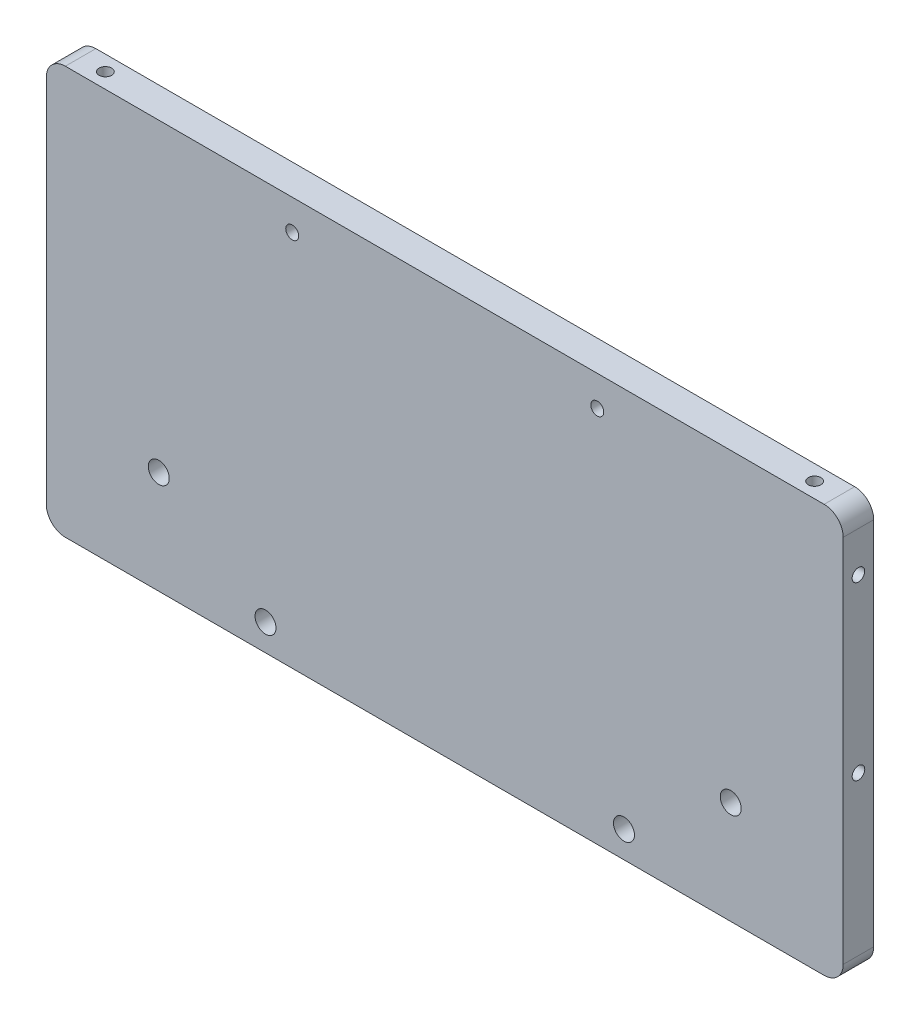
ISO-10303-21;
HEADER;
FILE_DESCRIPTION(('STEP AP214'),'2;1');
FILE_NAME('part.step','',(''),(''),'','','');
FILE_SCHEMA(('AUTOMOTIVE_DESIGN { 1 0 10303 214 1 1 1 1 }'));
ENDSEC;
DATA;
#1=APPLICATION_CONTEXT('core data for automotive mechanical design processes');
#2=APPLICATION_PROTOCOL_DEFINITION('international standard','automotive_design',2000,#1);
#3=PRODUCT_CONTEXT('',#1,'mechanical');
#4=PRODUCT('Part','Part','',(#3));
#5=PRODUCT_RELATED_PRODUCT_CATEGORY('part','',(#4));
#6=PRODUCT_DEFINITION_FORMATION('','',#4);
#7=PRODUCT_DEFINITION_CONTEXT('part definition',#1,'design');
#8=PRODUCT_DEFINITION('design','',#6,#7);
#9=PRODUCT_DEFINITION_SHAPE('','',#8);
#10=(LENGTH_UNIT() NAMED_UNIT(*) SI_UNIT(.MILLI.,.METRE.));
#11=(NAMED_UNIT(*) PLANE_ANGLE_UNIT() SI_UNIT($,.RADIAN.));
#12=(NAMED_UNIT(*) SI_UNIT($,.STERADIAN.) SOLID_ANGLE_UNIT());
#13=UNCERTAINTY_MEASURE_WITH_UNIT(LENGTH_MEASURE(1.E-05),#10,'distance_accuracy_value','');
#14=(GEOMETRIC_REPRESENTATION_CONTEXT(3) GLOBAL_UNCERTAINTY_ASSIGNED_CONTEXT((#13)) GLOBAL_UNIT_ASSIGNED_CONTEXT((#10,
#11,#12)) REPRESENTATION_CONTEXT('',''));
#15=CARTESIAN_POINT('',(0.,0.,0.));
#16=DIRECTION('',(0.,0.,1.));
#17=DIRECTION('',(1.,0.,0.));
#18=AXIS2_PLACEMENT_3D('',#15,#16,#17);
#19=CARTESIAN_POINT('',(74.0201446615174,36.0226601883938,4.));
#20=DIRECTION('',(1.,0.,0.));
#21=DIRECTION('',(0.,0.,-1.));
#22=AXIS2_PLACEMENT_3D('',#19,#20,#21);
#23=CONICAL_SURFACE('',#22,1.65000000002146,1.02974425869627);
#24=CARTESIAN_POINT('',(73.0287246401247,36.0226601883938,4.00000000007594));
#25=VERTEX_POINT('',#24);
#26=VERTEX_LOOP('',#25);
#27=FACE_BOUND('',#26,.T.);
#28=CARTESIAN_POINT('',(74.0201446614972,36.0226601883938,4.));
#29=DIRECTION('',(1.,0.,0.));
#30=DIRECTION('',(0.,0.,-1.));
#31=AXIS2_PLACEMENT_3D('',#28,#29,#30);
#32=CIRCLE('',#31,1.64999999999999);
#33=CARTESIAN_POINT('',(74.0201446614972,36.0226601883938,2.35000000000001));
#34=VERTEX_POINT('',#33);
#35=EDGE_CURVE('E107',#34,#34,#32,.T.);
#36=ORIENTED_EDGE('',*,*,#35,.T.);
#37=EDGE_LOOP('',(#36));
#38=FACE_BOUND('',#37,.T.);
#39=ADVANCED_FACE('F17',(#27,#38),#23,.F.);
#40=CARTESIAN_POINT('',(74.0201446615174,81.0226601883938,4.));
#41=DIRECTION('',(1.,0.,0.));
#42=DIRECTION('',(0.,0.,-1.));
#43=AXIS2_PLACEMENT_3D('',#40,#41,#42);
#44=CONICAL_SURFACE('',#43,1.65000000002146,1.02974425869627);
#45=CARTESIAN_POINT('',(73.0287246401247,81.0226601883938,4.00000000007594));
#46=VERTEX_POINT('',#45);
#47=VERTEX_LOOP('',#46);
#48=FACE_BOUND('',#47,.T.);
#49=CARTESIAN_POINT('',(74.0201446614972,81.0226601883938,4.));
#50=DIRECTION('',(1.,0.,0.));
#51=DIRECTION('',(0.,0.,-1.));
#52=AXIS2_PLACEMENT_3D('',#49,#50,#51);
#53=CIRCLE('',#52,1.64999999999998);
#54=CARTESIAN_POINT('',(74.0201446614972,81.0226601883938,2.35000000000002));
#55=VERTEX_POINT('',#54);
#56=EDGE_CURVE('E109',#55,#55,#53,.T.);
#57=ORIENTED_EDGE('',*,*,#56,.T.);
#58=EDGE_LOOP('',(#57));
#59=FACE_BOUND('',#58,.T.);
#60=ADVANCED_FACE('F104',(#48,#59),#44,.F.);
#61=CARTESIAN_POINT('',(72.6201446614971,86.4226601883615,4.));
#62=DIRECTION('',(0.,1.,0.));
#63=DIRECTION('',(0.,0.,1.));
#64=AXIS2_PLACEMENT_3D('',#61,#62,#63);
#65=CONICAL_SURFACE('',#64,1.64999999994598,1.02974425867096);
#66=CARTESIAN_POINT('',(72.6201446614971,85.4312401669688,3.99999999996226));
#67=VERTEX_POINT('',#66);
#68=VERTEX_LOOP('',#67);
#69=FACE_BOUND('',#68,.T.);
#70=CARTESIAN_POINT('',(72.6201446614971,86.4226601883897,4.));
#71=DIRECTION('',(0.,1.,0.));
#72=DIRECTION('',(0.,0.,1.));
#73=AXIS2_PLACEMENT_3D('',#70,#71,#72);
#74=CIRCLE('',#73,1.64999999999998);
#75=CARTESIAN_POINT('',(72.6201446614971,86.4226601883897,5.64999999999999));
#76=VERTEX_POINT('',#75);
#77=EDGE_CURVE('E112',#76,#76,#74,.T.);
#78=ORIENTED_EDGE('',*,*,#77,.T.);
#79=EDGE_LOOP('',(#78));
#80=FACE_BOUND('',#79,.T.);
#81=ADVANCED_FACE('F218',(#69,#80),#65,.F.);
#82=CARTESIAN_POINT('',(-113.379855338503,86.4226601883615,4.00000000000002));
#83=DIRECTION('',(0.,1.,0.));
#84=DIRECTION('',(0.,0.,1.));
#85=AXIS2_PLACEMENT_3D('',#82,#83,#84);
#86=CONICAL_SURFACE('',#85,1.64999999994595,1.02974425867096);
#87=CARTESIAN_POINT('',(-113.379855338503,85.4312401669688,3.99999999996226));
#88=VERTEX_POINT('',#87);
#89=VERTEX_LOOP('',#88);
#90=FACE_BOUND('',#89,.T.);
#91=CARTESIAN_POINT('',(-113.379855338503,86.4226601883897,4.00000000000002));
#92=DIRECTION('',(0.,1.,0.));
#93=DIRECTION('',(0.,0.,1.));
#94=AXIS2_PLACEMENT_3D('',#91,#92,#93);
#95=CIRCLE('',#94,1.64999999999998);
#96=CARTESIAN_POINT('',(-113.379855338503,86.4226601883897,5.65000000000001));
#97=VERTEX_POINT('',#96);
#98=EDGE_CURVE('E209',#97,#97,#95,.T.);
#99=ORIENTED_EDGE('',*,*,#98,.T.);
#100=EDGE_LOOP('',(#99));
#101=FACE_BOUND('',#100,.T.);
#102=ADVANCED_FACE('F318',(#90,#101),#86,.F.);
#103=CARTESIAN_POINT('',(-114.779855338497,36.0226601883938,4.));
#104=DIRECTION('',(-1.,0.,0.));
#105=DIRECTION('',(0.,-1.,0.));
#106=AXIS2_PLACEMENT_3D('',#103,#104,#105);
#107=CONICAL_SURFACE('',#106,1.64999999994598,1.02974425867096);
#108=CARTESIAN_POINT('',(-113.788435317105,36.0226601883938,3.99999999996226));
#109=VERTEX_POINT('',#108);
#110=VERTEX_LOOP('',#109);
#111=FACE_BOUND('',#110,.T.);
#112=CARTESIAN_POINT('',(-114.779855338503,36.0226601883938,4.));
#113=DIRECTION('',(-1.,0.,0.));
#114=DIRECTION('',(0.,0.,1.));
#115=AXIS2_PLACEMENT_3D('',#112,#113,#114);
#116=CIRCLE('',#115,1.64999999999999);
#117=CARTESIAN_POINT('',(-114.779855338503,36.0226601883938,5.64999999999999));
#118=VERTEX_POINT('',#117);
#119=EDGE_CURVE('E204',#118,#118,#116,.T.);
#120=ORIENTED_EDGE('',*,*,#119,.T.);
#121=EDGE_LOOP('',(#120));
#122=FACE_BOUND('',#121,.T.);
#123=ADVANCED_FACE('F315',(#111,#122),#107,.F.);
#124=CARTESIAN_POINT('',(-114.779855338497,81.0226601883938,4.));
#125=DIRECTION('',(-1.,0.,0.));
#126=DIRECTION('',(0.,-1.,0.));
#127=AXIS2_PLACEMENT_3D('',#124,#125,#126);
#128=CONICAL_SURFACE('',#127,1.64999999994598,1.02974425867096);
#129=CARTESIAN_POINT('',(-113.788435317105,81.0226601883938,3.99999999996226));
#130=VERTEX_POINT('',#129);
#131=VERTEX_LOOP('',#130);
#132=FACE_BOUND('',#131,.T.);
#133=CARTESIAN_POINT('',(-114.779855338503,81.0226601883938,4.));
#134=DIRECTION('',(-1.,0.,0.));
#135=DIRECTION('',(0.,0.,1.));
#136=AXIS2_PLACEMENT_3D('',#133,#134,#135);
#137=CIRCLE('',#136,1.64999999999998);
#138=CARTESIAN_POINT('',(-114.779855338503,81.0226601883938,5.64999999999999));
#139=VERTEX_POINT('',#138);
#140=EDGE_CURVE('E200',#139,#139,#137,.T.);
#141=ORIENTED_EDGE('',*,*,#140,.T.);
#142=EDGE_LOOP('',(#141));
#143=FACE_BOUND('',#142,.T.);
#144=ADVANCED_FACE('F312',(#132,#143),#128,.F.);
#145=CARTESIAN_POINT('',(-60.3798553385029,88.5226601883938,5.6843418860808E-11));
#146=DIRECTION('',(0.,0.,-1.));
#147=DIRECTION('',(-1.,0.,0.));
#148=AXIS2_PLACEMENT_3D('',#145,#146,#147);
#149=CONICAL_SURFACE('',#148,3.29999999991813,0.785398163397448);
#150=CARTESIAN_POINT('',(-60.3798553385029,88.5226601883938,0.));
#151=DIRECTION('',(0.,0.,-1.));
#152=DIRECTION('',(-1.,0.,0.));
#153=AXIS2_PLACEMENT_3D('',#150,#151,#152);
#154=CIRCLE('',#153,3.29999999997497);
#155=CARTESIAN_POINT('',(-63.6798553384779,88.5226601883938,0.));
#156=VERTEX_POINT('',#155);
#157=EDGE_CURVE('E20',#156,#156,#154,.T.);
#158=ORIENTED_EDGE('',*,*,#157,.T.);
#159=EDGE_LOOP('',(#158));
#160=FACE_BOUND('',#159,.T.);
#161=CARTESIAN_POINT('',(-60.3798553385029,88.5226601883938,1.6));
#162=DIRECTION('',(0.,0.,-1.));
#163=DIRECTION('',(-1.,0.,0.));
#164=AXIS2_PLACEMENT_3D('',#161,#162,#163);
#165=CIRCLE('',#164,1.7);
#166=CARTESIAN_POINT('',(-62.0798553385029,88.5226601883938,1.6));
#167=VERTEX_POINT('',#166);
#168=EDGE_CURVE('E186',#167,#167,#165,.F.);
#169=ORIENTED_EDGE('',*,*,#168,.T.);
#170=EDGE_LOOP('',(#169));
#171=FACE_BOUND('',#170,.T.);
#172=ADVANCED_FACE('F309',(#160,#171),#149,.F.);
#173=CARTESIAN_POINT('',(19.6201446614971,88.5226601883938,-5.6843418860808E-11));
#174=DIRECTION('',(0.,0.,-1.));
#175=DIRECTION('',(-1.,0.,0.));
#176=AXIS2_PLACEMENT_3D('',#173,#174,#175);
#177=CONICAL_SURFACE('',#176,3.30000000004773,0.785398163397448);
#178=CARTESIAN_POINT('',(19.6201446614971,88.5226601883938,0.));
#179=DIRECTION('',(0.,0.,-1.));
#180=DIRECTION('',(-1.,0.,0.));
#181=AXIS2_PLACEMENT_3D('',#178,#179,#180);
#182=CIRCLE('',#181,3.29999999999089);
#183=CARTESIAN_POINT('',(16.3201446615062,88.5226601883938,0.));
#184=VERTEX_POINT('',#183);
#185=EDGE_CURVE('E195',#184,#184,#182,.T.);
#186=ORIENTED_EDGE('',*,*,#185,.T.);
#187=EDGE_LOOP('',(#186));
#188=FACE_BOUND('',#187,.T.);
#189=CARTESIAN_POINT('',(19.6201446614971,88.5226601883938,1.6));
#190=DIRECTION('',(0.,0.,-1.));
#191=DIRECTION('',(-1.,0.,0.));
#192=AXIS2_PLACEMENT_3D('',#189,#190,#191);
#193=CIRCLE('',#192,1.7);
#194=CARTESIAN_POINT('',(17.9201446614971,88.5226601883938,1.6));
#195=VERTEX_POINT('',#194);
#196=EDGE_CURVE('E393',#195,#195,#193,.F.);
#197=ORIENTED_EDGE('',*,*,#196,.T.);
#198=EDGE_LOOP('',(#197));
#199=FACE_BOUND('',#198,.T.);
#200=ADVANCED_FACE('F306',(#188,#199),#177,.F.);
#201=CARTESIAN_POINT('',(84.1201446614972,36.0226601883938,4.));
#202=DIRECTION('',(1.,0.,0.));
#203=DIRECTION('',(0.,0.,-1.));
#204=AXIS2_PLACEMENT_3D('',#201,#202,#203);
#205=CYLINDRICAL_SURFACE('',#204,1.64999999999999);
#206=ORIENTED_EDGE('',*,*,#35,.F.);
#207=EDGE_LOOP('',(#206));
#208=FACE_BOUND('',#207,.T.);
#209=CARTESIAN_POINT('',(84.1201446614972,36.0226601883938,4.));
#210=DIRECTION('',(1.,0.,0.));
#211=DIRECTION('',(0.,0.,-1.));
#212=AXIS2_PLACEMENT_3D('',#209,#210,#211);
#213=CIRCLE('',#212,1.64999999999999);
#214=CARTESIAN_POINT('',(84.1201446614972,36.0226601883938,2.35000000000001));
#215=VERTEX_POINT('',#214);
#216=EDGE_CURVE('E176',#215,#215,#213,.T.);
#217=ORIENTED_EDGE('',*,*,#216,.T.);
#218=EDGE_LOOP('',(#217));
#219=FACE_BOUND('',#218,.T.);
#220=ADVANCED_FACE('F302',(#208,#219),#205,.F.);
#221=CARTESIAN_POINT('',(84.1201446614972,81.0226601883938,4.));
#222=DIRECTION('',(1.,0.,0.));
#223=DIRECTION('',(0.,0.,-1.));
#224=AXIS2_PLACEMENT_3D('',#221,#222,#223);
#225=CYLINDRICAL_SURFACE('',#224,1.64999999999998);
#226=ORIENTED_EDGE('',*,*,#56,.F.);
#227=EDGE_LOOP('',(#226));
#228=FACE_BOUND('',#227,.T.);
#229=CARTESIAN_POINT('',(84.1201446614972,81.0226601883938,4.));
#230=DIRECTION('',(1.,0.,0.));
#231=DIRECTION('',(0.,0.,-1.));
#232=AXIS2_PLACEMENT_3D('',#229,#230,#231);
#233=CIRCLE('',#232,1.64999999999998);
#234=CARTESIAN_POINT('',(84.1201446614972,81.0226601883938,2.35000000000002));
#235=VERTEX_POINT('',#234);
#236=EDGE_CURVE('E172',#235,#235,#233,.T.);
#237=ORIENTED_EDGE('',*,*,#236,.T.);
#238=EDGE_LOOP('',(#237));
#239=FACE_BOUND('',#238,.T.);
#240=ADVANCED_FACE('F224',(#228,#239),#225,.F.);
#241=CARTESIAN_POINT('',(72.6201446614971,96.5226601883897,4.));
#242=DIRECTION('',(0.,1.,0.));
#243=DIRECTION('',(0.,0.,1.));
#244=AXIS2_PLACEMENT_3D('',#241,#242,#243);
#245=CYLINDRICAL_SURFACE('',#244,1.64999999999998);
#246=ORIENTED_EDGE('',*,*,#77,.F.);
#247=EDGE_LOOP('',(#246));
#248=FACE_BOUND('',#247,.T.);
#249=CARTESIAN_POINT('',(72.6201446614971,96.5226601883897,4.));
#250=DIRECTION('',(0.,1.,0.));
#251=DIRECTION('',(0.,0.,1.));
#252=AXIS2_PLACEMENT_3D('',#249,#250,#251);
#253=CIRCLE('',#252,1.64999999999998);
#254=CARTESIAN_POINT('',(72.6201446614971,96.5226601883897,5.64999999999999));
#255=VERTEX_POINT('',#254);
#256=EDGE_CURVE('E165',#255,#255,#253,.T.);
#257=ORIENTED_EDGE('',*,*,#256,.T.);
#258=EDGE_LOOP('',(#257));
#259=FACE_BOUND('',#258,.T.);
#260=ADVANCED_FACE('F220',(#248,#259),#245,.F.);
#261=CARTESIAN_POINT('',(-113.379855338503,96.5226601883897,4.00000000000002));
#262=DIRECTION('',(0.,1.,0.));
#263=DIRECTION('',(0.,0.,1.));
#264=AXIS2_PLACEMENT_3D('',#261,#262,#263);
#265=CYLINDRICAL_SURFACE('',#264,1.64999999999998);
#266=ORIENTED_EDGE('',*,*,#98,.F.);
#267=EDGE_LOOP('',(#266));
#268=FACE_BOUND('',#267,.T.);
#269=CARTESIAN_POINT('',(-113.379855338503,96.5226601883897,4.00000000000002));
#270=DIRECTION('',(0.,1.,0.));
#271=DIRECTION('',(0.,0.,1.));
#272=AXIS2_PLACEMENT_3D('',#269,#270,#271);
#273=CIRCLE('',#272,1.64999999999998);
#274=CARTESIAN_POINT('',(-113.379855338503,96.5226601883897,5.65000000000001));
#275=VERTEX_POINT('',#274);
#276=EDGE_CURVE('E161',#275,#275,#273,.T.);
#277=ORIENTED_EDGE('',*,*,#276,.T.);
#278=EDGE_LOOP('',(#277));
#279=FACE_BOUND('',#278,.T.);
#280=ADVANCED_FACE('F223',(#268,#279),#265,.F.);
#281=CARTESIAN_POINT('',(-124.879855338503,36.0226601883938,4.));
#282=DIRECTION('',(-1.,0.,0.));
#283=DIRECTION('',(0.,0.,1.));
#284=AXIS2_PLACEMENT_3D('',#281,#282,#283);
#285=CYLINDRICAL_SURFACE('',#284,1.64999999999999);
#286=ORIENTED_EDGE('',*,*,#119,.F.);
#287=EDGE_LOOP('',(#286));
#288=FACE_BOUND('',#287,.T.);
#289=CARTESIAN_POINT('',(-124.879855338503,36.0226601883938,4.));
#290=DIRECTION('',(-1.,0.,0.));
#291=DIRECTION('',(0.,0.,1.));
#292=AXIS2_PLACEMENT_3D('',#289,#290,#291);
#293=CIRCLE('',#292,1.64999999999999);
#294=CARTESIAN_POINT('',(-124.879855338503,36.0226601883938,5.64999999999999));
#295=VERTEX_POINT('',#294);
#296=EDGE_CURVE('E155',#295,#295,#293,.T.);
#297=ORIENTED_EDGE('',*,*,#296,.T.);
#298=EDGE_LOOP('',(#297));
#299=FACE_BOUND('',#298,.T.);
#300=ADVANCED_FACE('F283',(#288,#299),#285,.F.);
#301=CARTESIAN_POINT('',(-124.879855338503,81.0226601883938,4.));
#302=DIRECTION('',(-1.,0.,0.));
#303=DIRECTION('',(0.,0.,1.));
#304=AXIS2_PLACEMENT_3D('',#301,#302,#303);
#305=CYLINDRICAL_SURFACE('',#304,1.64999999999998);
#306=ORIENTED_EDGE('',*,*,#140,.F.);
#307=EDGE_LOOP('',(#306));
#308=FACE_BOUND('',#307,.T.);
#309=CARTESIAN_POINT('',(-124.879855338503,81.0226601883938,4.));
#310=DIRECTION('',(-1.,0.,0.));
#311=DIRECTION('',(0.,0.,1.));
#312=AXIS2_PLACEMENT_3D('',#309,#310,#311);
#313=CIRCLE('',#312,1.64999999999998);
#314=CARTESIAN_POINT('',(-124.879855338503,81.0226601883938,5.64999999999999));
#315=VERTEX_POINT('',#314);
#316=EDGE_CURVE('E151',#315,#315,#313,.T.);
#317=ORIENTED_EDGE('',*,*,#316,.T.);
#318=EDGE_LOOP('',(#317));
#319=FACE_BOUND('',#318,.T.);
#320=ADVANCED_FACE('F285',(#308,#319),#305,.F.);
#321=CARTESIAN_POINT('',(-58.9680885595513,72.9812333598177,0.));
#322=DIRECTION('',(0.,0.,1.));
#323=DIRECTION('',(1.,0.,0.));
#324=AXIS2_PLACEMENT_3D('',#321,#322,#323);
#325=PLANE('',#324);
#326=CARTESIAN_POINT('',(-95.3798553385029,16.5226601883938,5.6843418860808E-11));
#327=DIRECTION('',(0.,0.,-1.));
#328=DIRECTION('',(-1.,0.,0.));
#329=AXIS2_PLACEMENT_3D('',#326,#327,#328);
#330=CIRCLE('',#329,5.59999999999103);
#331=CARTESIAN_POINT('',(-100.979855338494,16.5226601883938,5.6843418860808E-11));
#332=VERTEX_POINT('',#331);
#333=EDGE_CURVE('E183',#332,#332,#330,.F.);
#334=ORIENTED_EDGE('',*,*,#333,.T.);
#335=EDGE_LOOP('',(#334));
#336=FACE_BOUND('',#335,.T.);
#337=CARTESIAN_POINT('',(-67.3798553385029,-3.47733981160619,0.));
#338=DIRECTION('',(0.,0.,-1.));
#339=DIRECTION('',(-1.,0.,0.));
#340=AXIS2_PLACEMENT_3D('',#337,#338,#339);
#341=CIRCLE('',#340,5.6000000000847);
#342=CARTESIAN_POINT('',(-72.9798553385876,-3.47733981160619,0.));
#343=VERTEX_POINT('',#342);
#344=EDGE_CURVE('E187',#343,#343,#341,.F.);
#345=ORIENTED_EDGE('',*,*,#344,.T.);
#346=EDGE_LOOP('',(#345));
#347=FACE_BOUND('',#346,.T.);
#348=CARTESIAN_POINT('',(26.6201446614959,-3.47733981160619,-5.6843418860808E-11));
#349=DIRECTION('',(0.,0.,-1.));
#350=DIRECTION('',(-1.,0.,0.));
#351=AXIS2_PLACEMENT_3D('',#348,#349,#350);
#352=CIRCLE('',#351,5.60000000003261);
#353=CARTESIAN_POINT('',(21.0201446614633,-3.47733981160619,-5.6843418860808E-11));
#354=VERTEX_POINT('',#353);
#355=EDGE_CURVE('E190',#354,#354,#352,.F.);
#356=ORIENTED_EDGE('',*,*,#355,.T.);
#357=EDGE_LOOP('',(#356));
#358=FACE_BOUND('',#357,.T.);
#359=CARTESIAN_POINT('',(54.6201446614959,16.5226601883938,-5.6843418860808E-11));
#360=DIRECTION('',(0.,0.,-1.));
#361=DIRECTION('',(-1.,0.,0.));
#362=AXIS2_PLACEMENT_3D('',#359,#360,#361);
#363=CIRCLE('',#362,5.60000000001261);
#364=CARTESIAN_POINT('',(49.0201446614833,16.5226601883938,-5.6843418860808E-11));
#365=VERTEX_POINT('',#364);
#366=EDGE_CURVE('E193',#365,#365,#363,.F.);
#367=ORIENTED_EDGE('',*,*,#366,.T.);
#368=EDGE_LOOP('',(#367));
#369=FACE_BOUND('',#368,.T.);
#370=CARTESIAN_POINT('',(79.1201446614972,-5.47733981160619,0.));
#371=DIRECTION('',(0.,0.,-1.));
#372=DIRECTION('',(-1.,0.,0.));
#373=AXIS2_PLACEMENT_3D('',#370,#371,#372);
#374=CIRCLE('',#373,5.);
#375=CARTESIAN_POINT('',(79.1201446614972,-10.4773398116062,0.));
#376=VERTEX_POINT('',#375);
#377=CARTESIAN_POINT('',(84.1201446614972,-5.47733981160619,0.));
#378=VERTEX_POINT('',#377);
#379=EDGE_CURVE('E179',#376,#378,#374,.F.);
#380=ORIENTED_EDGE('',*,*,#379,.F.);
#381=DIRECTION('',(-1.,0.,0.));
#382=VECTOR('',#381,1.);
#383=CARTESIAN_POINT('',(-104.379855338503,-10.4773398116062,0.));
#384=LINE('',#383,#382);
#385=CARTESIAN_POINT('',(-119.879855338503,-10.4773398116062,0.));
#386=VERTEX_POINT('',#385);
#387=EDGE_CURVE('E82',#376,#386,#384,.T.);
#388=ORIENTED_EDGE('',*,*,#387,.T.);
#389=CARTESIAN_POINT('',(-119.879855338503,-5.47733981160619,0.));
#390=DIRECTION('',(0.,0.,-1.));
#391=DIRECTION('',(-1.,0.,0.));
#392=AXIS2_PLACEMENT_3D('',#389,#390,#391);
#393=CIRCLE('',#392,5.);
#394=CARTESIAN_POINT('',(-124.879855338503,-5.47733981160619,0.));
#395=VERTEX_POINT('',#394);
#396=EDGE_CURVE('E147',#395,#386,#393,.F.);
#397=ORIENTED_EDGE('',*,*,#396,.F.);
#398=DIRECTION('',(0.,1.,0.));
#399=VECTOR('',#398,1.);
#400=CARTESIAN_POINT('',(-124.879855338503,48.4882623302138,0.));
#401=LINE('',#400,#399);
#402=CARTESIAN_POINT('',(-124.879855338503,91.5226601883896,0.));
#403=VERTEX_POINT('',#402);
#404=EDGE_CURVE('E410',#395,#403,#401,.T.);
#405=ORIENTED_EDGE('',*,*,#404,.T.);
#406=CARTESIAN_POINT('',(-119.879855338503,91.5226601883896,0.));
#407=DIRECTION('',(0.,0.,-1.));
#408=DIRECTION('',(-1.,0.,0.));
#409=AXIS2_PLACEMENT_3D('',#406,#407,#408);
#410=CIRCLE('',#409,5.);
#411=CARTESIAN_POINT('',(-119.879855338503,96.5226601883897,0.));
#412=VERTEX_POINT('',#411);
#413=EDGE_CURVE('E158',#412,#403,#410,.F.);
#414=ORIENTED_EDGE('',*,*,#413,.F.);
#415=DIRECTION('',(1.,0.,0.));
#416=VECTOR('',#415,1.);
#417=CARTESIAN_POINT('',(11.6201446614967,96.5226601883897,0.));
#418=LINE('',#417,#416);
#419=CARTESIAN_POINT('',(79.1201446614972,96.5226601883897,0.));
#420=VERTEX_POINT('',#419);
#421=EDGE_CURVE('E164',#412,#420,#418,.T.);
#422=ORIENTED_EDGE('',*,*,#421,.T.);
#423=CARTESIAN_POINT('',(79.1201446614972,91.5226601883896,0.));
#424=DIRECTION('',(0.,0.,-1.));
#425=DIRECTION('',(-1.,0.,0.));
#426=AXIS2_PLACEMENT_3D('',#423,#424,#425);
#427=CIRCLE('',#426,5.);
#428=CARTESIAN_POINT('',(84.1201446614972,91.5226601883896,0.));
#429=VERTEX_POINT('',#428);
#430=EDGE_CURVE('E168',#429,#420,#427,.F.);
#431=ORIENTED_EDGE('',*,*,#430,.F.);
#432=DIRECTION('',(0.,-1.,0.));
#433=VECTOR('',#432,1.);
#434=CARTESIAN_POINT('',(84.1201446614972,-10.4773398116062,0.));
#435=LINE('',#434,#433);
#436=EDGE_CURVE('E175',#429,#378,#435,.T.);
#437=ORIENTED_EDGE('',*,*,#436,.T.);
#438=EDGE_LOOP('',(#380,#388,#397,#405,#414,#422,#431,#437));
#439=FACE_BOUND('',#438,.T.);
#440=ORIENTED_EDGE('',*,*,#185,.F.);
#441=EDGE_LOOP('',(#440));
#442=FACE_BOUND('',#441,.T.);
#443=ORIENTED_EDGE('',*,*,#157,.F.);
#444=EDGE_LOOP('',(#443));
#445=FACE_BOUND('',#444,.T.);
#446=ADVANCED_FACE('F292',(#336,#347,#358,#369,#439,#442,#445),#325,.F.);
#447=CARTESIAN_POINT('',(54.6201446614959,16.5226601883938,-5.6843418860808E-11));
#448=DIRECTION('',(0.,0.,-1.));
#449=DIRECTION('',(-1.,0.,0.));
#450=AXIS2_PLACEMENT_3D('',#447,#448,#449);
#451=CONICAL_SURFACE('',#450,5.60000000001261,0.785398163397448);
#452=ORIENTED_EDGE('',*,*,#366,.F.);
#453=EDGE_LOOP('',(#452));
#454=FACE_BOUND('',#453,.T.);
#455=CARTESIAN_POINT('',(54.6201446614959,16.5226601883938,2.85));
#456=DIRECTION('',(0.,0.,-1.));
#457=DIRECTION('',(-1.,0.,0.));
#458=AXIS2_PLACEMENT_3D('',#455,#456,#457);
#459=CIRCLE('',#458,2.75);
#460=CARTESIAN_POINT('',(51.8701446614959,16.5226601883938,2.85));
#461=VERTEX_POINT('',#460);
#462=EDGE_CURVE('E407',#461,#461,#459,.F.);
#463=ORIENTED_EDGE('',*,*,#462,.T.);
#464=EDGE_LOOP('',(#463));
#465=FACE_BOUND('',#464,.T.);
#466=ADVANCED_FACE('F369',(#454,#465),#451,.F.);
#467=CARTESIAN_POINT('',(26.6201446614959,-3.47733981160619,5.6843418860808E-11));
#468=DIRECTION('',(0.,0.,-1.));
#469=DIRECTION('',(-1.,0.,0.));
#470=AXIS2_PLACEMENT_3D('',#467,#468,#469);
#471=CONICAL_SURFACE('',#470,5.59999999991892,0.785398163397448);
#472=ORIENTED_EDGE('',*,*,#355,.F.);
#473=EDGE_LOOP('',(#472));
#474=FACE_BOUND('',#473,.T.);
#475=CARTESIAN_POINT('',(26.6201446614959,-3.47733981160619,2.85));
#476=DIRECTION('',(0.,0.,-1.));
#477=DIRECTION('',(-1.,0.,0.));
#478=AXIS2_PLACEMENT_3D('',#475,#476,#477);
#479=CIRCLE('',#478,2.75);
#480=CARTESIAN_POINT('',(23.8701446614959,-3.47733981160619,2.85));
#481=VERTEX_POINT('',#480);
#482=EDGE_CURVE('E404',#481,#481,#479,.F.);
#483=ORIENTED_EDGE('',*,*,#482,.T.);
#484=EDGE_LOOP('',(#483));
#485=FACE_BOUND('',#484,.T.);
#486=ADVANCED_FACE('F365',(#474,#485),#471,.F.);
#487=CARTESIAN_POINT('',(-67.3798553385029,-3.47733981160619,0.));
#488=DIRECTION('',(0.,0.,-1.));
#489=DIRECTION('',(-1.,0.,0.));
#490=AXIS2_PLACEMENT_3D('',#487,#488,#489);
#491=CONICAL_SURFACE('',#490,5.6000000000847,0.785398163407421);
#492=ORIENTED_EDGE('',*,*,#344,.F.);
#493=EDGE_LOOP('',(#492));
#494=FACE_BOUND('',#493,.T.);
#495=CARTESIAN_POINT('',(-67.3798553385029,-3.47733981160619,2.85));
#496=DIRECTION('',(0.,0.,-1.));
#497=DIRECTION('',(-1.,0.,0.));
#498=AXIS2_PLACEMENT_3D('',#495,#496,#497);
#499=CIRCLE('',#498,2.75);
#500=CARTESIAN_POINT('',(-70.1298553385029,-3.47733981160619,2.85));
#501=VERTEX_POINT('',#500);
#502=EDGE_CURVE('E401',#501,#501,#499,.F.);
#503=ORIENTED_EDGE('',*,*,#502,.T.);
#504=EDGE_LOOP('',(#503));
#505=FACE_BOUND('',#504,.T.);
#506=ADVANCED_FACE('F361',(#494,#505),#491,.F.);
#507=CARTESIAN_POINT('',(-95.3798553385029,16.5226601883938,5.6843418860808E-11));
#508=DIRECTION('',(0.,0.,-1.));
#509=DIRECTION('',(-1.,0.,0.));
#510=AXIS2_PLACEMENT_3D('',#507,#508,#509);
#511=CONICAL_SURFACE('',#510,5.59999999999103,0.785398163397448);
#512=ORIENTED_EDGE('',*,*,#333,.F.);
#513=EDGE_LOOP('',(#512));
#514=FACE_BOUND('',#513,.T.);
#515=CARTESIAN_POINT('',(-95.3798553385029,16.5226601883938,2.85));
#516=DIRECTION('',(0.,0.,-1.));
#517=DIRECTION('',(-1.,0.,0.));
#518=AXIS2_PLACEMENT_3D('',#515,#516,#517);
#519=CIRCLE('',#518,2.75);
#520=CARTESIAN_POINT('',(-98.1298553385029,16.5226601883938,2.85));
#521=VERTEX_POINT('',#520);
#522=EDGE_CURVE('E146',#521,#521,#519,.F.);
#523=ORIENTED_EDGE('',*,*,#522,.T.);
#524=EDGE_LOOP('',(#523));
#525=FACE_BOUND('',#524,.T.);
#526=ADVANCED_FACE('F357',(#514,#525),#511,.F.);
#527=CARTESIAN_POINT('',(-60.3798553385029,88.5226601883938,0.));
#528=DIRECTION('',(0.,0.,-1.));
#529=DIRECTION('',(-1.,0.,0.));
#530=AXIS2_PLACEMENT_3D('',#527,#528,#529);
#531=CYLINDRICAL_SURFACE('',#530,1.7);
#532=ORIENTED_EDGE('',*,*,#168,.F.);
#533=EDGE_LOOP('',(#532));
#534=FACE_BOUND('',#533,.T.);
#535=CARTESIAN_POINT('',(-60.3798553385029,88.5226601883938,8.));
#536=DIRECTION('',(0.,0.,-1.));
#537=DIRECTION('',(-1.,0.,0.));
#538=AXIS2_PLACEMENT_3D('',#535,#536,#537);
#539=CIRCLE('',#538,1.7);
#540=CARTESIAN_POINT('',(-62.0798553385029,88.5226601883938,8.));
#541=VERTEX_POINT('',#540);
#542=EDGE_CURVE('E143',#541,#541,#539,.T.);
#543=ORIENTED_EDGE('',*,*,#542,.F.);
#544=EDGE_LOOP('',(#543));
#545=FACE_BOUND('',#544,.T.);
#546=ADVANCED_FACE('F353',(#534,#545),#531,.F.);
#547=CARTESIAN_POINT('',(19.6201446614971,88.5226601883938,0.));
#548=DIRECTION('',(0.,0.,-1.));
#549=DIRECTION('',(-1.,0.,0.));
#550=AXIS2_PLACEMENT_3D('',#547,#548,#549);
#551=CYLINDRICAL_SURFACE('',#550,1.7);
#552=ORIENTED_EDGE('',*,*,#196,.F.);
#553=EDGE_LOOP('',(#552));
#554=FACE_BOUND('',#553,.T.);
#555=CARTESIAN_POINT('',(19.6201446614971,88.5226601883938,8.));
#556=DIRECTION('',(0.,0.,-1.));
#557=DIRECTION('',(-1.,0.,0.));
#558=AXIS2_PLACEMENT_3D('',#555,#556,#557);
#559=CIRCLE('',#558,1.7);
#560=CARTESIAN_POINT('',(17.9201446614971,88.5226601883938,8.));
#561=VERTEX_POINT('',#560);
#562=EDGE_CURVE('E140',#561,#561,#559,.T.);
#563=ORIENTED_EDGE('',*,*,#562,.F.);
#564=EDGE_LOOP('',(#563));
#565=FACE_BOUND('',#564,.T.);
#566=ADVANCED_FACE('F350',(#554,#565),#551,.F.);
#567=CARTESIAN_POINT('',(-104.379855338503,-10.4773398116062,8.));
#568=DIRECTION('',(0.,1.,0.));
#569=DIRECTION('',(-1.,0.,0.));
#570=AXIS2_PLACEMENT_3D('',#567,#568,#569);
#571=PLANE('',#570);
#572=DIRECTION('',(0.,0.,-1.));
#573=VECTOR('',#572,1.);
#574=CARTESIAN_POINT('',(79.1201446614972,-10.4773398116062,8.));
#575=LINE('',#574,#573);
#576=CARTESIAN_POINT('',(79.1201446614972,-10.4773398116062,8.));
#577=VERTEX_POINT('',#576);
#578=EDGE_CURVE('E182',#577,#376,#575,.T.);
#579=ORIENTED_EDGE('',*,*,#578,.F.);
#580=DIRECTION('',(1.,0.,0.));
#581=VECTOR('',#580,1.);
#582=CARTESIAN_POINT('',(-58.9680885595513,-10.4773398116062,8.));
#583=LINE('',#582,#581);
#584=CARTESIAN_POINT('',(-119.879855338503,-10.4773398116062,8.));
#585=VERTEX_POINT('',#584);
#586=EDGE_CURVE('E139',#585,#577,#583,.T.);
#587=ORIENTED_EDGE('',*,*,#586,.F.);
#588=DIRECTION('',(0.,0.,-1.));
#589=VECTOR('',#588,1.);
#590=CARTESIAN_POINT('',(-119.879855338503,-10.4773398116062,8.));
#591=LINE('',#590,#589);
#592=EDGE_CURVE('E150',#386,#585,#591,.F.);
#593=ORIENTED_EDGE('',*,*,#592,.F.);
#594=ORIENTED_EDGE('',*,*,#387,.F.);
#595=EDGE_LOOP('',(#579,#587,#593,#594));
#596=FACE_BOUND('',#595,.T.);
#597=ADVANCED_FACE('F343',(#596),#571,.F.);
#598=CARTESIAN_POINT('',(79.1201446614972,-5.47733981160619,8.));
#599=DIRECTION('',(0.,0.,-1.));
#600=DIRECTION('',(-1.,0.,0.));
#601=AXIS2_PLACEMENT_3D('',#598,#599,#600);
#602=CYLINDRICAL_SURFACE('',#601,5.);
#603=ORIENTED_EDGE('',*,*,#379,.T.);
#604=DIRECTION('',(0.,0.,1.));
#605=VECTOR('',#604,1.);
#606=CARTESIAN_POINT('',(84.1201446614972,-5.47733981160619,8.));
#607=LINE('',#606,#605);
#608=CARTESIAN_POINT('',(84.1201446614972,-5.47733981160619,8.));
#609=VERTEX_POINT('',#608);
#610=EDGE_CURVE('E397',#378,#609,#607,.T.);
#611=ORIENTED_EDGE('',*,*,#610,.T.);
#612=CARTESIAN_POINT('',(79.1201446614972,-5.47733981160619,8.));
#613=DIRECTION('',(0.,0.,-1.));
#614=DIRECTION('',(-1.,0.,0.));
#615=AXIS2_PLACEMENT_3D('',#612,#613,#614);
#616=CIRCLE('',#615,5.);
#617=EDGE_CURVE('E136',#577,#609,#616,.F.);
#618=ORIENTED_EDGE('',*,*,#617,.F.);
#619=ORIENTED_EDGE('',*,*,#578,.T.);
#620=EDGE_LOOP('',(#603,#611,#618,#619));
#621=FACE_BOUND('',#620,.T.);
#622=ADVANCED_FACE('F335',(#621),#602,.T.);
#623=CARTESIAN_POINT('',(84.1201446614972,-10.4773398116062,8.));
#624=DIRECTION('',(-1.,0.,0.));
#625=DIRECTION('',(0.,-1.,0.));
#626=AXIS2_PLACEMENT_3D('',#623,#624,#625);
#627=PLANE('',#626);
#628=ORIENTED_EDGE('',*,*,#610,.F.);
#629=ORIENTED_EDGE('',*,*,#436,.F.);
#630=DIRECTION('',(0.,0.,-1.));
#631=VECTOR('',#630,1.);
#632=CARTESIAN_POINT('',(84.1201446614972,91.5226601883896,8.));
#633=LINE('',#632,#631);
#634=CARTESIAN_POINT('',(84.1201446614972,91.5226601883896,8.));
#635=VERTEX_POINT('',#634);
#636=EDGE_CURVE('E171',#635,#429,#633,.T.);
#637=ORIENTED_EDGE('',*,*,#636,.F.);
#638=DIRECTION('',(0.,1.,0.));
#639=VECTOR('',#638,1.);
#640=CARTESIAN_POINT('',(84.1201446614972,72.9812333598177,8.));
#641=LINE('',#640,#639);
#642=EDGE_CURVE('E135',#609,#635,#641,.T.);
#643=ORIENTED_EDGE('',*,*,#642,.F.);
#644=EDGE_LOOP('',(#628,#629,#637,#643));
#645=FACE_BOUND('',#644,.T.);
#646=ORIENTED_EDGE('',*,*,#236,.F.);
#647=EDGE_LOOP('',(#646));
#648=FACE_BOUND('',#647,.T.);
#649=ORIENTED_EDGE('',*,*,#216,.F.);
#650=EDGE_LOOP('',(#649));
#651=FACE_BOUND('',#650,.T.);
#652=ADVANCED_FACE('F242',(#645,#648,#651),#627,.F.);
#653=CARTESIAN_POINT('',(79.1201446614972,91.5226601883896,8.));
#654=DIRECTION('',(0.,0.,-1.));
#655=DIRECTION('',(-1.,0.,0.));
#656=AXIS2_PLACEMENT_3D('',#653,#654,#655);
#657=CYLINDRICAL_SURFACE('',#656,5.);
#658=ORIENTED_EDGE('',*,*,#430,.T.);
#659=DIRECTION('',(0.,0.,-1.));
#660=VECTOR('',#659,1.);
#661=CARTESIAN_POINT('',(79.1201446614972,96.5226601883897,8.));
#662=LINE('',#661,#660);
#663=CARTESIAN_POINT('',(79.1201446614972,96.5226601883897,8.));
#664=VERTEX_POINT('',#663);
#665=EDGE_CURVE('E414',#420,#664,#662,.F.);
#666=ORIENTED_EDGE('',*,*,#665,.T.);
#667=CARTESIAN_POINT('',(79.1201446614972,91.5226601883896,8.));
#668=DIRECTION('',(0.,0.,-1.));
#669=DIRECTION('',(-1.,0.,0.));
#670=AXIS2_PLACEMENT_3D('',#667,#668,#669);
#671=CIRCLE('',#670,5.);
#672=EDGE_CURVE('E132',#635,#664,#671,.F.);
#673=ORIENTED_EDGE('',*,*,#672,.F.);
#674=ORIENTED_EDGE('',*,*,#636,.T.);
#675=EDGE_LOOP('',(#658,#666,#673,#674));
#676=FACE_BOUND('',#675,.T.);
#677=ADVANCED_FACE('F231',(#676),#657,.T.);
#678=CARTESIAN_POINT('',(11.6201446614967,96.5226601883897,8.));
#679=DIRECTION('',(0.,-1.,0.));
#680=DIRECTION('',(0.,0.,-1.));
#681=AXIS2_PLACEMENT_3D('',#678,#679,#680);
#682=PLANE('',#681);
#683=ORIENTED_EDGE('',*,*,#665,.F.);
#684=ORIENTED_EDGE('',*,*,#421,.F.);
#685=DIRECTION('',(0.,0.,-1.));
#686=VECTOR('',#685,1.);
#687=CARTESIAN_POINT('',(-119.879855338503,96.5226601883897,8.));
#688=LINE('',#687,#686);
#689=CARTESIAN_POINT('',(-119.879855338503,96.5226601883897,8.));
#690=VERTEX_POINT('',#689);
#691=EDGE_CURVE('E160',#690,#412,#688,.T.);
#692=ORIENTED_EDGE('',*,*,#691,.F.);
#693=DIRECTION('',(1.,0.,0.));
#694=VECTOR('',#693,1.);
#695=CARTESIAN_POINT('',(-58.9680885595513,96.5226601883897,8.));
#696=LINE('',#695,#694);
#697=EDGE_CURVE('E131',#664,#690,#696,.F.);
#698=ORIENTED_EDGE('',*,*,#697,.F.);
#699=EDGE_LOOP('',(#683,#684,#692,#698));
#700=FACE_BOUND('',#699,.T.);
#701=ORIENTED_EDGE('',*,*,#276,.F.);
#702=EDGE_LOOP('',(#701));
#703=FACE_BOUND('',#702,.T.);
#704=ORIENTED_EDGE('',*,*,#256,.F.);
#705=EDGE_LOOP('',(#704));
#706=FACE_BOUND('',#705,.T.);
#707=ADVANCED_FACE('F228',(#700,#703,#706),#682,.F.);
#708=CARTESIAN_POINT('',(-119.879855338503,91.5226601883896,8.));
#709=DIRECTION('',(0.,0.,-1.));
#710=DIRECTION('',(-1.,0.,0.));
#711=AXIS2_PLACEMENT_3D('',#708,#709,#710);
#712=CYLINDRICAL_SURFACE('',#711,5.);
#713=ORIENTED_EDGE('',*,*,#413,.T.);
#714=DIRECTION('',(0.,0.,1.));
#715=VECTOR('',#714,1.);
#716=CARTESIAN_POINT('',(-124.879855338503,91.5226601883896,8.));
#717=LINE('',#716,#715);
#718=CARTESIAN_POINT('',(-124.879855338503,91.5226601883896,8.));
#719=VERTEX_POINT('',#718);
#720=EDGE_CURVE('E154',#403,#719,#717,.T.);
#721=ORIENTED_EDGE('',*,*,#720,.T.);
#722=CARTESIAN_POINT('',(-119.879855338503,91.5226601883896,8.));
#723=DIRECTION('',(0.,0.,-1.));
#724=DIRECTION('',(-1.,0.,0.));
#725=AXIS2_PLACEMENT_3D('',#722,#723,#724);
#726=CIRCLE('',#725,5.);
#727=EDGE_CURVE('E128',#690,#719,#726,.F.);
#728=ORIENTED_EDGE('',*,*,#727,.F.);
#729=ORIENTED_EDGE('',*,*,#691,.T.);
#730=EDGE_LOOP('',(#713,#721,#728,#729));
#731=FACE_BOUND('',#730,.T.);
#732=ADVANCED_FACE('F230',(#731),#712,.T.);
#733=CARTESIAN_POINT('',(-124.879855338503,48.4882623302138,8.));
#734=DIRECTION('',(1.,0.,0.));
#735=DIRECTION('',(0.,1.,0.));
#736=AXIS2_PLACEMENT_3D('',#733,#734,#735);
#737=PLANE('',#736);
#738=DIRECTION('',(0.,0.,-1.));
#739=VECTOR('',#738,1.);
#740=CARTESIAN_POINT('',(-124.879855338503,-5.47733981160619,8.));
#741=LINE('',#740,#739);
#742=CARTESIAN_POINT('',(-124.879855338503,-5.47733981160619,8.));
#743=VERTEX_POINT('',#742);
#744=EDGE_CURVE('E35',#743,#395,#741,.T.);
#745=ORIENTED_EDGE('',*,*,#744,.F.);
#746=DIRECTION('',(0.,1.,0.));
#747=VECTOR('',#746,1.);
#748=CARTESIAN_POINT('',(-124.879855338503,72.9812333598177,8.));
#749=LINE('',#748,#747);
#750=EDGE_CURVE('E127',#719,#743,#749,.F.);
#751=ORIENTED_EDGE('',*,*,#750,.F.);
#752=ORIENTED_EDGE('',*,*,#720,.F.);
#753=ORIENTED_EDGE('',*,*,#404,.F.);
#754=EDGE_LOOP('',(#745,#751,#752,#753));
#755=FACE_BOUND('',#754,.T.);
#756=ORIENTED_EDGE('',*,*,#316,.F.);
#757=EDGE_LOOP('',(#756));
#758=FACE_BOUND('',#757,.T.);
#759=ORIENTED_EDGE('',*,*,#296,.F.);
#760=EDGE_LOOP('',(#759));
#761=FACE_BOUND('',#760,.T.);
#762=ADVANCED_FACE('F239',(#755,#758,#761),#737,.F.);
#763=CARTESIAN_POINT('',(-119.879855338503,-5.47733981160619,8.));
#764=DIRECTION('',(0.,0.,-1.));
#765=DIRECTION('',(-1.,0.,0.));
#766=AXIS2_PLACEMENT_3D('',#763,#764,#765);
#767=CYLINDRICAL_SURFACE('',#766,5.);
#768=ORIENTED_EDGE('',*,*,#396,.T.);
#769=ORIENTED_EDGE('',*,*,#592,.T.);
#770=CARTESIAN_POINT('',(-119.879855338503,-5.47733981160619,8.));
#771=DIRECTION('',(0.,0.,-1.));
#772=DIRECTION('',(-1.,0.,0.));
#773=AXIS2_PLACEMENT_3D('',#770,#771,#772);
#774=CIRCLE('',#773,5.);
#775=EDGE_CURVE('E124',#743,#585,#774,.F.);
#776=ORIENTED_EDGE('',*,*,#775,.F.);
#777=ORIENTED_EDGE('',*,*,#744,.T.);
#778=EDGE_LOOP('',(#768,#769,#776,#777));
#779=FACE_BOUND('',#778,.T.);
#780=ADVANCED_FACE('F270',(#779),#767,.T.);
#781=CARTESIAN_POINT('',(54.6201446614959,16.5226601883938,0.));
#782=DIRECTION('',(0.,0.,-1.));
#783=DIRECTION('',(-1.,0.,0.));
#784=AXIS2_PLACEMENT_3D('',#781,#782,#783);
#785=CYLINDRICAL_SURFACE('',#784,2.75);
#786=ORIENTED_EDGE('',*,*,#462,.F.);
#787=EDGE_LOOP('',(#786));
#788=FACE_BOUND('',#787,.T.);
#789=CARTESIAN_POINT('',(54.6201446614959,16.5226601883938,8.));
#790=DIRECTION('',(0.,0.,-1.));
#791=DIRECTION('',(-1.,0.,0.));
#792=AXIS2_PLACEMENT_3D('',#789,#790,#791);
#793=CIRCLE('',#792,2.75);
#794=CARTESIAN_POINT('',(51.8701446614959,16.5226601883938,8.));
#795=VERTEX_POINT('',#794);
#796=EDGE_CURVE('E121',#795,#795,#793,.T.);
#797=ORIENTED_EDGE('',*,*,#796,.F.);
#798=EDGE_LOOP('',(#797));
#799=FACE_BOUND('',#798,.T.);
#800=ADVANCED_FACE('F266',(#788,#799),#785,.F.);
#801=CARTESIAN_POINT('',(26.6201446614959,-3.47733981160619,0.));
#802=DIRECTION('',(0.,0.,-1.));
#803=DIRECTION('',(-1.,0.,0.));
#804=AXIS2_PLACEMENT_3D('',#801,#802,#803);
#805=CYLINDRICAL_SURFACE('',#804,2.75);
#806=ORIENTED_EDGE('',*,*,#482,.F.);
#807=EDGE_LOOP('',(#806));
#808=FACE_BOUND('',#807,.T.);
#809=CARTESIAN_POINT('',(26.6201446614959,-3.47733981160619,8.));
#810=DIRECTION('',(0.,0.,-1.));
#811=DIRECTION('',(-1.,0.,0.));
#812=AXIS2_PLACEMENT_3D('',#809,#810,#811);
#813=CIRCLE('',#812,2.75);
#814=CARTESIAN_POINT('',(23.8701446614959,-3.47733981160619,8.));
#815=VERTEX_POINT('',#814);
#816=EDGE_CURVE('E118',#815,#815,#813,.T.);
#817=ORIENTED_EDGE('',*,*,#816,.F.);
#818=EDGE_LOOP('',(#817));
#819=FACE_BOUND('',#818,.T.);
#820=ADVANCED_FACE('F262',(#808,#819),#805,.F.);
#821=CARTESIAN_POINT('',(-67.3798553385029,-3.47733981160619,0.));
#822=DIRECTION('',(0.,0.,-1.));
#823=DIRECTION('',(-1.,0.,0.));
#824=AXIS2_PLACEMENT_3D('',#821,#822,#823);
#825=CYLINDRICAL_SURFACE('',#824,2.75);
#826=ORIENTED_EDGE('',*,*,#502,.F.);
#827=EDGE_LOOP('',(#826));
#828=FACE_BOUND('',#827,.T.);
#829=CARTESIAN_POINT('',(-67.3798553385029,-3.47733981160619,8.));
#830=DIRECTION('',(0.,0.,-1.));
#831=DIRECTION('',(-1.,0.,0.));
#832=AXIS2_PLACEMENT_3D('',#829,#830,#831);
#833=CIRCLE('',#832,2.75);
#834=CARTESIAN_POINT('',(-70.1298553385029,-3.47733981160619,8.));
#835=VERTEX_POINT('',#834);
#836=EDGE_CURVE('E26',#835,#835,#833,.T.);
#837=ORIENTED_EDGE('',*,*,#836,.F.);
#838=EDGE_LOOP('',(#837));
#839=FACE_BOUND('',#838,.T.);
#840=ADVANCED_FACE('F255',(#828,#839),#825,.F.);
#841=CARTESIAN_POINT('',(-95.3798553385029,16.5226601883938,0.));
#842=DIRECTION('',(0.,0.,-1.));
#843=DIRECTION('',(-1.,0.,0.));
#844=AXIS2_PLACEMENT_3D('',#841,#842,#843);
#845=CYLINDRICAL_SURFACE('',#844,2.75);
#846=ORIENTED_EDGE('',*,*,#522,.F.);
#847=EDGE_LOOP('',(#846));
#848=FACE_BOUND('',#847,.T.);
#849=CARTESIAN_POINT('',(-95.3798553385029,16.5226601883938,8.));
#850=DIRECTION('',(0.,0.,-1.));
#851=DIRECTION('',(-1.,0.,0.));
#852=AXIS2_PLACEMENT_3D('',#849,#850,#851);
#853=CIRCLE('',#852,2.75);
#854=CARTESIAN_POINT('',(-98.1298553385029,16.5226601883938,8.));
#855=VERTEX_POINT('',#854);
#856=EDGE_CURVE('E11',#855,#855,#853,.T.);
#857=ORIENTED_EDGE('',*,*,#856,.F.);
#858=EDGE_LOOP('',(#857));
#859=FACE_BOUND('',#858,.T.);
#860=ADVANCED_FACE('F249',(#848,#859),#845,.F.);
#861=CARTESIAN_POINT('',(-58.9680885595513,72.9812333598177,8.));
#862=DIRECTION('',(0.,0.,1.));
#863=DIRECTION('',(1.,0.,0.));
#864=AXIS2_PLACEMENT_3D('',#861,#862,#863);
#865=PLANE('',#864);
#866=ORIENTED_EDGE('',*,*,#856,.T.);
#867=EDGE_LOOP('',(#866));
#868=FACE_BOUND('',#867,.T.);
#869=ORIENTED_EDGE('',*,*,#836,.T.);
#870=EDGE_LOOP('',(#869));
#871=FACE_BOUND('',#870,.T.);
#872=ORIENTED_EDGE('',*,*,#816,.T.);
#873=EDGE_LOOP('',(#872));
#874=FACE_BOUND('',#873,.T.);
#875=ORIENTED_EDGE('',*,*,#796,.T.);
#876=EDGE_LOOP('',(#875));
#877=FACE_BOUND('',#876,.T.);
#878=ORIENTED_EDGE('',*,*,#750,.T.);
#879=ORIENTED_EDGE('',*,*,#775,.T.);
#880=ORIENTED_EDGE('',*,*,#586,.T.);
#881=ORIENTED_EDGE('',*,*,#617,.T.);
#882=ORIENTED_EDGE('',*,*,#642,.T.);
#883=ORIENTED_EDGE('',*,*,#672,.T.);
#884=ORIENTED_EDGE('',*,*,#697,.T.);
#885=ORIENTED_EDGE('',*,*,#727,.T.);
#886=EDGE_LOOP('',(#878,#879,#880,#881,#882,#883,#884,#885));
#887=FACE_BOUND('',#886,.T.);
#888=ORIENTED_EDGE('',*,*,#562,.T.);
#889=EDGE_LOOP('',(#888));
#890=FACE_BOUND('',#889,.T.);
#891=ORIENTED_EDGE('',*,*,#542,.T.);
#892=EDGE_LOOP('',(#891));
#893=FACE_BOUND('',#892,.T.);
#894=ADVANCED_FACE('F247',(#868,#871,#874,#877,#887,#890,#893),#865,.T.);
#895=CLOSED_SHELL('',(#39,#60,#81,#102,#123,#144,#172,#200,#220,#240,#260,#280,#300,#320,#446,
#466,#486,#506,#526,#546,#566,#597,#622,#652,#677,#707,#732,#762,#780,#800,#820,#840,#860,#894));
#896=MANIFOLD_SOLID_BREP('B1',#895);
#897=ADVANCED_BREP_SHAPE_REPRESENTATION('',(#18,#896),#14);
#898=SHAPE_DEFINITION_REPRESENTATION(#9,#897);
ENDSEC;
END-ISO-10303-21;
